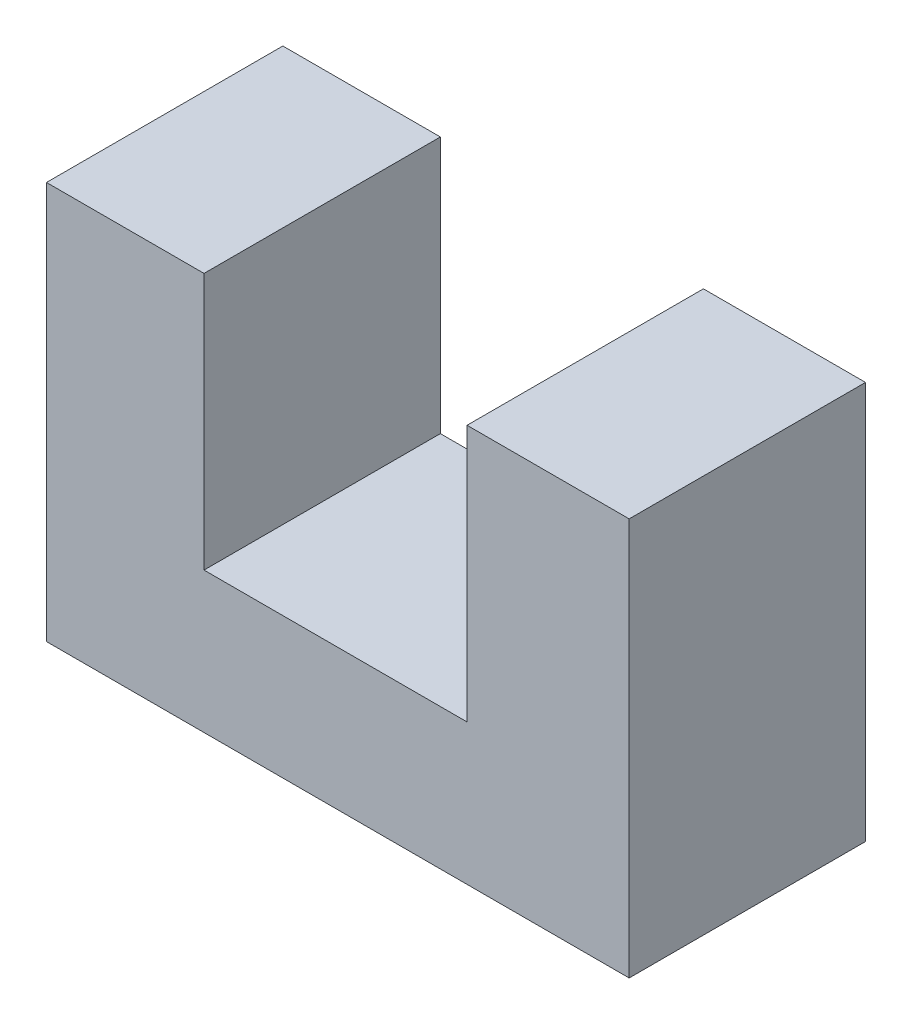
ISO-10303-21;
HEADER;
FILE_DESCRIPTION(('STEP AP214'),'2;1');
FILE_NAME('part.step','',(''),(''),'','','');
FILE_SCHEMA(('AUTOMOTIVE_DESIGN { 1 0 10303 214 1 1 1 1 }'));
ENDSEC;
DATA;
#1=APPLICATION_CONTEXT('core data for automotive mechanical design processes');
#2=APPLICATION_PROTOCOL_DEFINITION('international standard','automotive_design',2000,#1);
#3=PRODUCT_CONTEXT('',#1,'mechanical');
#4=PRODUCT('Part','Part','',(#3));
#5=PRODUCT_RELATED_PRODUCT_CATEGORY('part','',(#4));
#6=PRODUCT_DEFINITION_FORMATION('','',#4);
#7=PRODUCT_DEFINITION_CONTEXT('part definition',#1,'design');
#8=PRODUCT_DEFINITION('design','',#6,#7);
#9=PRODUCT_DEFINITION_SHAPE('','',#8);
#10=(LENGTH_UNIT() NAMED_UNIT(*) SI_UNIT(.MILLI.,.METRE.));
#11=(NAMED_UNIT(*) PLANE_ANGLE_UNIT() SI_UNIT($,.RADIAN.));
#12=(NAMED_UNIT(*) SI_UNIT($,.STERADIAN.) SOLID_ANGLE_UNIT());
#13=UNCERTAINTY_MEASURE_WITH_UNIT(LENGTH_MEASURE(1.E-05),#10,'distance_accuracy_value','');
#14=(GEOMETRIC_REPRESENTATION_CONTEXT(3) GLOBAL_UNCERTAINTY_ASSIGNED_CONTEXT((#13)) GLOBAL_UNIT_ASSIGNED_CONTEXT((#10,
#11,#12)) REPRESENTATION_CONTEXT('',''));
#15=CARTESIAN_POINT('',(0.,0.,0.));
#16=DIRECTION('',(0.,0.,1.));
#17=DIRECTION('',(1.,0.,0.));
#18=AXIS2_PLACEMENT_3D('',#15,#16,#17);
#19=CARTESIAN_POINT('',(0.,47.434795910733,28.194));
#20=DIRECTION('',(1.,0.,0.));
#21=DIRECTION('',(0.,0.,-1.));
#22=AXIS2_PLACEMENT_3D('',#19,#20,#21);
#23=PLANE('',#22);
#24=DIRECTION('',(0.,-1.,0.));
#25=VECTOR('',#24,1.);
#26=CARTESIAN_POINT('',(0.,47.434795910733,0.));
#27=LINE('',#26,#25);
#28=CARTESIAN_POINT('',(0.,47.434795910733,0.));
#29=VERTEX_POINT('',#28);
#30=CARTESIAN_POINT('',(0.,0.,0.));
#31=VERTEX_POINT('',#30);
#32=EDGE_CURVE('E133',#29,#31,#27,.T.);
#33=ORIENTED_EDGE('',*,*,#32,.T.);
#34=DIRECTION('',(0.,0.,-1.));
#35=VECTOR('',#34,1.);
#36=CARTESIAN_POINT('',(0.,0.,28.194));
#37=LINE('',#36,#35);
#38=CARTESIAN_POINT('',(0.,0.,28.194));
#39=VERTEX_POINT('',#38);
#40=EDGE_CURVE('E11',#39,#31,#37,.T.);
#41=ORIENTED_EDGE('',*,*,#40,.F.);
#42=DIRECTION('',(0.,-1.,0.));
#43=VECTOR('',#42,1.);
#44=CARTESIAN_POINT('',(0.,47.434795910733,28.194));
#45=LINE('',#44,#43);
#46=CARTESIAN_POINT('',(0.,47.434795910733,28.194));
#47=VERTEX_POINT('',#46);
#48=EDGE_CURVE('E147',#47,#39,#45,.T.);
#49=ORIENTED_EDGE('',*,*,#48,.F.);
#50=DIRECTION('',(0.,0.,-1.));
#51=VECTOR('',#50,1.);
#52=CARTESIAN_POINT('',(0.,47.434795910733,28.194));
#53=LINE('',#52,#51);
#54=EDGE_CURVE('E129',#47,#29,#53,.T.);
#55=ORIENTED_EDGE('',*,*,#54,.T.);
#56=EDGE_LOOP('',(#33,#41,#49,#55));
#57=FACE_BOUND('',#56,.T.);
#58=ADVANCED_FACE('F37',(#57),#23,.F.);
#59=CARTESIAN_POINT('',(0.,0.,28.194));
#60=DIRECTION('',(0.,1.,0.));
#61=DIRECTION('',(0.,0.,1.));
#62=AXIS2_PLACEMENT_3D('',#59,#60,#61);
#63=PLANE('',#62);
#64=DIRECTION('',(1.,0.,0.));
#65=VECTOR('',#64,1.);
#66=CARTESIAN_POINT('',(0.,0.,0.));
#67=LINE('',#66,#65);
#68=CARTESIAN_POINT('',(69.5102201614972,0.,0.));
#69=VERTEX_POINT('',#68);
#70=EDGE_CURVE('E136',#31,#69,#67,.T.);
#71=ORIENTED_EDGE('',*,*,#70,.T.);
#72=DIRECTION('',(0.,0.,-1.));
#73=VECTOR('',#72,1.);
#74=CARTESIAN_POINT('',(69.5102201614972,0.,28.194));
#75=LINE('',#74,#73);
#76=CARTESIAN_POINT('',(69.5102201614972,0.,28.194));
#77=VERTEX_POINT('',#76);
#78=EDGE_CURVE('E45',#77,#69,#75,.T.);
#79=ORIENTED_EDGE('',*,*,#78,.F.);
#80=DIRECTION('',(1.,0.,0.));
#81=VECTOR('',#80,1.);
#82=CARTESIAN_POINT('',(0.,0.,28.194));
#83=LINE('',#82,#81);
#84=EDGE_CURVE('E96',#39,#77,#83,.T.);
#85=ORIENTED_EDGE('',*,*,#84,.F.);
#86=ORIENTED_EDGE('',*,*,#40,.T.);
#87=EDGE_LOOP('',(#71,#79,#85,#86));
#88=FACE_BOUND('',#87,.T.);
#89=ADVANCED_FACE('F182',(#88),#63,.F.);
#90=CARTESIAN_POINT('',(69.5102201614972,0.,28.194));
#91=DIRECTION('',(-1.,0.,0.));
#92=DIRECTION('',(0.,0.,1.));
#93=AXIS2_PLACEMENT_3D('',#90,#91,#92);
#94=PLANE('',#93);
#95=DIRECTION('',(0.,1.,0.));
#96=VECTOR('',#95,1.);
#97=CARTESIAN_POINT('',(69.5102201614972,0.,0.));
#98=LINE('',#97,#96);
#99=CARTESIAN_POINT('',(69.5102201614972,47.434795910733,0.));
#100=VERTEX_POINT('',#99);
#101=EDGE_CURVE('E138',#69,#100,#98,.T.);
#102=ORIENTED_EDGE('',*,*,#101,.T.);
#103=DIRECTION('',(0.,0.,-1.));
#104=VECTOR('',#103,1.);
#105=CARTESIAN_POINT('',(69.5102201614972,47.434795910733,28.194));
#106=LINE('',#105,#104);
#107=CARTESIAN_POINT('',(69.5102201614972,47.434795910733,28.194));
#108=VERTEX_POINT('',#107);
#109=EDGE_CURVE('E154',#108,#100,#106,.T.);
#110=ORIENTED_EDGE('',*,*,#109,.F.);
#111=DIRECTION('',(0.,1.,0.));
#112=VECTOR('',#111,1.);
#113=CARTESIAN_POINT('',(69.5102201614972,0.,28.194));
#114=LINE('',#113,#112);
#115=EDGE_CURVE('E162',#77,#108,#114,.T.);
#116=ORIENTED_EDGE('',*,*,#115,.F.);
#117=ORIENTED_EDGE('',*,*,#78,.T.);
#118=EDGE_LOOP('',(#102,#110,#116,#117));
#119=FACE_BOUND('',#118,.T.);
#120=ADVANCED_FACE('F160',(#119),#94,.F.);
#121=CARTESIAN_POINT('',(69.5102201614972,47.434795910733,28.194));
#122=DIRECTION('',(0.,-1.,0.));
#123=DIRECTION('',(0.,0.,-1.));
#124=AXIS2_PLACEMENT_3D('',#121,#122,#123);
#125=PLANE('',#124);
#126=DIRECTION('',(-1.,0.,0.));
#127=VECTOR('',#126,1.);
#128=CARTESIAN_POINT('',(69.5102201614972,47.434795910733,0.));
#129=LINE('',#128,#127);
#130=CARTESIAN_POINT('',(50.1714187517368,47.434795910733,0.));
#131=VERTEX_POINT('',#130);
#132=EDGE_CURVE('E140',#100,#131,#129,.T.);
#133=ORIENTED_EDGE('',*,*,#132,.T.);
#134=DIRECTION('',(0.,0.,-1.));
#135=VECTOR('',#134,1.);
#136=CARTESIAN_POINT('',(50.1714187517368,47.434795910733,28.194));
#137=LINE('',#136,#135);
#138=CARTESIAN_POINT('',(50.1714187517368,47.434795910733,28.194));
#139=VERTEX_POINT('',#138);
#140=EDGE_CURVE('E151',#139,#131,#137,.T.);
#141=ORIENTED_EDGE('',*,*,#140,.F.);
#142=DIRECTION('',(-1.,0.,0.));
#143=VECTOR('',#142,1.);
#144=CARTESIAN_POINT('',(69.5102201614972,47.434795910733,28.194));
#145=LINE('',#144,#143);
#146=EDGE_CURVE('E174',#108,#139,#145,.T.);
#147=ORIENTED_EDGE('',*,*,#146,.F.);
#148=ORIENTED_EDGE('',*,*,#109,.T.);
#149=EDGE_LOOP('',(#133,#141,#147,#148));
#150=FACE_BOUND('',#149,.T.);
#151=ADVANCED_FACE('F170',(#150),#125,.F.);
#152=CARTESIAN_POINT('',(50.1714187517368,47.434795910733,28.194));
#153=DIRECTION('',(1.,0.,0.));
#154=DIRECTION('',(0.,0.,-1.));
#155=AXIS2_PLACEMENT_3D('',#152,#153,#154);
#156=PLANE('',#155);
#157=DIRECTION('',(0.,-1.,0.));
#158=VECTOR('',#157,1.);
#159=CARTESIAN_POINT('',(50.1714187517368,47.434795910733,0.));
#160=LINE('',#159,#158);
#161=CARTESIAN_POINT('',(50.1714187517368,16.7846200914901,0.));
#162=VERTEX_POINT('',#161);
#163=EDGE_CURVE('E142',#131,#162,#160,.T.);
#164=ORIENTED_EDGE('',*,*,#163,.T.);
#165=DIRECTION('',(0.,0.,-1.));
#166=VECTOR('',#165,1.);
#167=CARTESIAN_POINT('',(50.1714187517368,16.7846200914901,28.194));
#168=LINE('',#167,#166);
#169=CARTESIAN_POINT('',(50.1714187517368,16.7846200914901,28.194));
#170=VERTEX_POINT('',#169);
#171=EDGE_CURVE('E124',#170,#162,#168,.T.);
#172=ORIENTED_EDGE('',*,*,#171,.F.);
#173=DIRECTION('',(0.,-1.,0.));
#174=VECTOR('',#173,1.);
#175=CARTESIAN_POINT('',(50.1714187517368,47.434795910733,28.194));
#176=LINE('',#175,#174);
#177=EDGE_CURVE('E115',#139,#170,#176,.T.);
#178=ORIENTED_EDGE('',*,*,#177,.F.);
#179=ORIENTED_EDGE('',*,*,#140,.T.);
#180=EDGE_LOOP('',(#164,#172,#178,#179));
#181=FACE_BOUND('',#180,.T.);
#182=ADVANCED_FACE('F173',(#181),#156,.F.);
#183=CARTESIAN_POINT('',(50.1714187517368,16.7846200914901,28.194));
#184=DIRECTION('',(0.,-1.,0.));
#185=DIRECTION('',(0.,0.,-1.));
#186=AXIS2_PLACEMENT_3D('',#183,#184,#185);
#187=PLANE('',#186);
#188=DIRECTION('',(-1.,0.,0.));
#189=VECTOR('',#188,1.);
#190=CARTESIAN_POINT('',(50.1714187517368,16.7846200914901,0.));
#191=LINE('',#190,#189);
#192=CARTESIAN_POINT('',(18.7914768415596,16.7846200914901,0.));
#193=VERTEX_POINT('',#192);
#194=EDGE_CURVE('E123',#162,#193,#191,.T.);
#195=ORIENTED_EDGE('',*,*,#194,.T.);
#196=DIRECTION('',(0.,0.,-1.));
#197=VECTOR('',#196,1.);
#198=CARTESIAN_POINT('',(18.7914768415596,16.7846200914901,28.194));
#199=LINE('',#198,#197);
#200=CARTESIAN_POINT('',(18.7914768415596,16.7846200914901,28.194));
#201=VERTEX_POINT('',#200);
#202=EDGE_CURVE('E120',#201,#193,#199,.T.);
#203=ORIENTED_EDGE('',*,*,#202,.F.);
#204=DIRECTION('',(-1.,0.,0.));
#205=VECTOR('',#204,1.);
#206=CARTESIAN_POINT('',(50.1714187517368,16.7846200914901,28.194));
#207=LINE('',#206,#205);
#208=EDGE_CURVE('E109',#170,#201,#207,.T.);
#209=ORIENTED_EDGE('',*,*,#208,.F.);
#210=ORIENTED_EDGE('',*,*,#171,.T.);
#211=EDGE_LOOP('',(#195,#203,#209,#210));
#212=FACE_BOUND('',#211,.T.);
#213=ADVANCED_FACE('F121',(#212),#187,.F.);
#214=CARTESIAN_POINT('',(18.7914768415596,16.7846200914901,28.194));
#215=DIRECTION('',(-1.,0.,0.));
#216=DIRECTION('',(0.,0.,1.));
#217=AXIS2_PLACEMENT_3D('',#214,#215,#216);
#218=PLANE('',#217);
#219=DIRECTION('',(0.,1.,0.));
#220=VECTOR('',#219,1.);
#221=CARTESIAN_POINT('',(18.7914768415596,16.7846200914901,0.));
#222=LINE('',#221,#220);
#223=CARTESIAN_POINT('',(18.7914768415596,47.434795910733,0.));
#224=VERTEX_POINT('',#223);
#225=EDGE_CURVE('E82',#193,#224,#222,.T.);
#226=ORIENTED_EDGE('',*,*,#225,.T.);
#227=DIRECTION('',(0.,0.,-1.));
#228=VECTOR('',#227,1.);
#229=CARTESIAN_POINT('',(18.7914768415596,47.434795910733,28.194));
#230=LINE('',#229,#228);
#231=CARTESIAN_POINT('',(18.7914768415596,47.434795910733,28.194));
#232=VERTEX_POINT('',#231);
#233=EDGE_CURVE('E125',#232,#224,#230,.T.);
#234=ORIENTED_EDGE('',*,*,#233,.F.);
#235=DIRECTION('',(0.,1.,0.));
#236=VECTOR('',#235,1.);
#237=CARTESIAN_POINT('',(18.7914768415596,16.7846200914901,28.194));
#238=LINE('',#237,#236);
#239=EDGE_CURVE('E113',#201,#232,#238,.T.);
#240=ORIENTED_EDGE('',*,*,#239,.F.);
#241=ORIENTED_EDGE('',*,*,#202,.T.);
#242=EDGE_LOOP('',(#226,#234,#240,#241));
#243=FACE_BOUND('',#242,.T.);
#244=ADVANCED_FACE('F127',(#243),#218,.F.);
#245=CARTESIAN_POINT('',(18.7914768415596,47.434795910733,28.194));
#246=DIRECTION('',(0.,-1.,0.));
#247=DIRECTION('',(0.,0.,-1.));
#248=AXIS2_PLACEMENT_3D('',#245,#246,#247);
#249=PLANE('',#248);
#250=DIRECTION('',(-1.,0.,0.));
#251=VECTOR('',#250,1.);
#252=CARTESIAN_POINT('',(18.7914768415596,47.434795910733,0.));
#253=LINE('',#252,#251);
#254=EDGE_CURVE('E88',#224,#29,#253,.T.);
#255=ORIENTED_EDGE('',*,*,#254,.T.);
#256=ORIENTED_EDGE('',*,*,#54,.F.);
#257=DIRECTION('',(-1.,0.,0.));
#258=VECTOR('',#257,1.);
#259=CARTESIAN_POINT('',(18.7914768415596,47.434795910733,28.194));
#260=LINE('',#259,#258);
#261=EDGE_CURVE('E53',#232,#47,#260,.T.);
#262=ORIENTED_EDGE('',*,*,#261,.F.);
#263=ORIENTED_EDGE('',*,*,#233,.T.);
#264=EDGE_LOOP('',(#255,#256,#262,#263));
#265=FACE_BOUND('',#264,.T.);
#266=ADVANCED_FACE('F198',(#265),#249,.F.);
#267=CARTESIAN_POINT('',(0.,0.,28.194));
#268=DIRECTION('',(0.,0.,1.));
#269=DIRECTION('',(1.,0.,0.));
#270=AXIS2_PLACEMENT_3D('',#267,#268,#269);
#271=PLANE('',#270);
#272=ORIENTED_EDGE('',*,*,#48,.T.);
#273=ORIENTED_EDGE('',*,*,#84,.T.);
#274=ORIENTED_EDGE('',*,*,#115,.T.);
#275=ORIENTED_EDGE('',*,*,#146,.T.);
#276=ORIENTED_EDGE('',*,*,#177,.T.);
#277=ORIENTED_EDGE('',*,*,#208,.T.);
#278=ORIENTED_EDGE('',*,*,#239,.T.);
#279=ORIENTED_EDGE('',*,*,#261,.T.);
#280=EDGE_LOOP('',(#272,#273,#274,#275,#276,#277,#278,#279));
#281=FACE_BOUND('',#280,.T.);
#282=ADVANCED_FACE('F111',(#281),#271,.T.);
#283=CARTESIAN_POINT('',(0.,0.,0.));
#284=DIRECTION('',(0.,0.,1.));
#285=DIRECTION('',(1.,0.,0.));
#286=AXIS2_PLACEMENT_3D('',#283,#284,#285);
#287=PLANE('',#286);
#288=ORIENTED_EDGE('',*,*,#32,.F.);
#289=ORIENTED_EDGE('',*,*,#254,.F.);
#290=ORIENTED_EDGE('',*,*,#225,.F.);
#291=ORIENTED_EDGE('',*,*,#194,.F.);
#292=ORIENTED_EDGE('',*,*,#163,.F.);
#293=ORIENTED_EDGE('',*,*,#132,.F.);
#294=ORIENTED_EDGE('',*,*,#101,.F.);
#295=ORIENTED_EDGE('',*,*,#70,.F.);
#296=EDGE_LOOP('',(#288,#289,#290,#291,#292,#293,#294,#295));
#297=FACE_BOUND('',#296,.T.);
#298=ADVANCED_FACE('F166',(#297),#287,.F.);
#299=CLOSED_SHELL('',(#58,#89,#120,#151,#182,#213,#244,#266,#282,#298));
#300=MANIFOLD_SOLID_BREP('B2',#299);
#301=ADVANCED_BREP_SHAPE_REPRESENTATION('',(#18,#300),#14);
#302=SHAPE_DEFINITION_REPRESENTATION(#9,#301);
ENDSEC;
END-ISO-10303-21;
